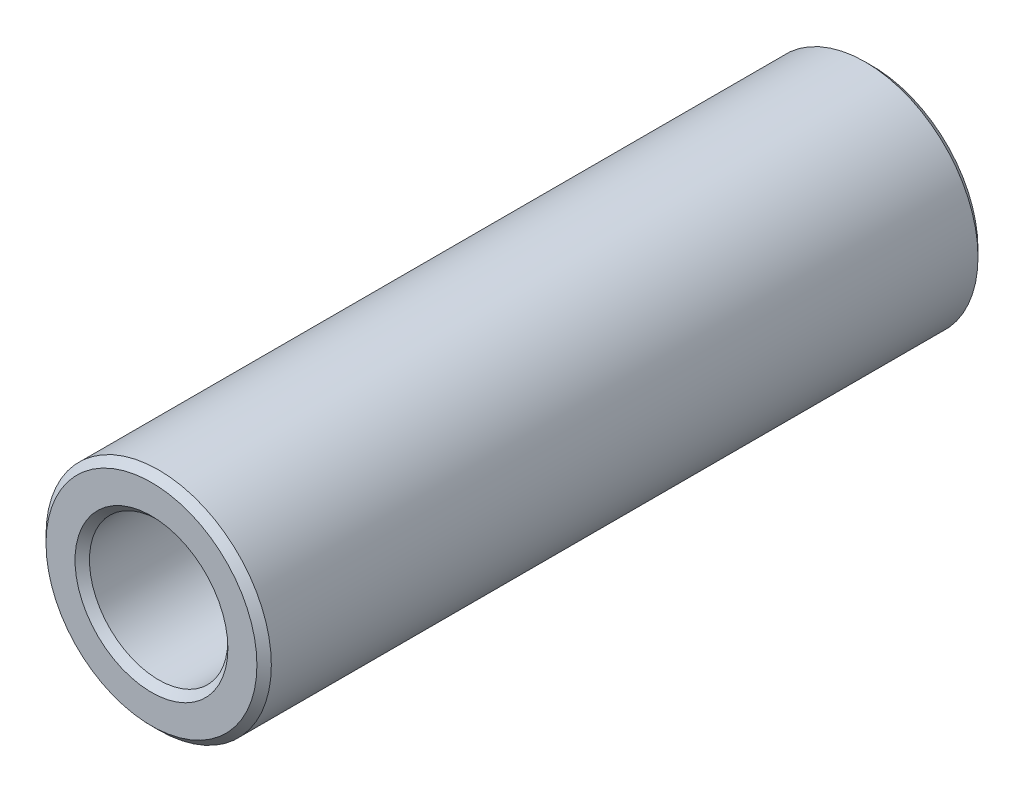
ISO-10303-21;
HEADER;
FILE_DESCRIPTION(('STEP AP214'),'2;1');
FILE_NAME('part.step','',(''),(''),'','','');
FILE_SCHEMA(('AUTOMOTIVE_DESIGN { 1 0 10303 214 1 1 1 1 }'));
ENDSEC;
DATA;
#1=APPLICATION_CONTEXT('core data for automotive mechanical design processes');
#2=APPLICATION_PROTOCOL_DEFINITION('international standard','automotive_design',2000,#1);
#3=PRODUCT_CONTEXT('',#1,'mechanical');
#4=PRODUCT('Part','Part','',(#3));
#5=PRODUCT_RELATED_PRODUCT_CATEGORY('part','',(#4));
#6=PRODUCT_DEFINITION_FORMATION('','',#4);
#7=PRODUCT_DEFINITION_CONTEXT('part definition',#1,'design');
#8=PRODUCT_DEFINITION('design','',#6,#7);
#9=PRODUCT_DEFINITION_SHAPE('','',#8);
#10=(LENGTH_UNIT() NAMED_UNIT(*) SI_UNIT(.MILLI.,.METRE.));
#11=(NAMED_UNIT(*) PLANE_ANGLE_UNIT() SI_UNIT($,.RADIAN.));
#12=(NAMED_UNIT(*) SI_UNIT($,.STERADIAN.) SOLID_ANGLE_UNIT());
#13=UNCERTAINTY_MEASURE_WITH_UNIT(LENGTH_MEASURE(1.E-05),#10,'distance_accuracy_value','');
#14=(GEOMETRIC_REPRESENTATION_CONTEXT(3) GLOBAL_UNCERTAINTY_ASSIGNED_CONTEXT((#13)) GLOBAL_UNIT_ASSIGNED_CONTEXT((#10,
#11,#12)) REPRESENTATION_CONTEXT('',''));
#15=CARTESIAN_POINT('',(0.,0.,0.));
#16=DIRECTION('',(0.,0.,1.));
#17=DIRECTION('',(1.,0.,0.));
#18=AXIS2_PLACEMENT_3D('',#15,#16,#17);
#19=CARTESIAN_POINT('',(0.,0.,25.146));
#20=DIRECTION('',(0.,0.,1.));
#21=DIRECTION('',(1.,0.,0.));
#22=AXIS2_PLACEMENT_3D('',#19,#20,#21);
#23=CONICAL_SURFACE('',#22,2.4384,0.785398163397442);
#24=CARTESIAN_POINT('',(0.,0.,25.146));
#25=DIRECTION('',(0.,0.,1.));
#26=DIRECTION('',(1.,0.,0.));
#27=AXIS2_PLACEMENT_3D('',#24,#25,#26);
#28=CIRCLE('',#27,2.4384);
#29=CARTESIAN_POINT('',(2.4384,0.,25.146));
#30=VERTEX_POINT('',#29);
#31=EDGE_CURVE('E27',#30,#30,#28,.T.);
#32=ORIENTED_EDGE('',*,*,#31,.F.);
#33=EDGE_LOOP('',(#32));
#34=FACE_BOUND('',#33,.T.);
#35=CARTESIAN_POINT('',(0.,0.,25.4));
#36=DIRECTION('',(0.,0.,-1.));
#37=DIRECTION('',(1.,0.,0.));
#38=AXIS2_PLACEMENT_3D('',#35,#36,#37);
#39=CIRCLE('',#38,2.6924);
#40=CARTESIAN_POINT('',(2.6924,0.,25.4));
#41=VERTEX_POINT('',#40);
#42=EDGE_CURVE('E57',#41,#41,#39,.T.);
#43=ORIENTED_EDGE('',*,*,#42,.F.);
#44=EDGE_LOOP('',(#43));
#45=FACE_BOUND('',#44,.T.);
#46=ADVANCED_FACE('F16',(#34,#45),#23,.F.);
#47=CARTESIAN_POINT('',(0.,0.,0.));
#48=DIRECTION('',(0.,0.,-1.));
#49=DIRECTION('',(-1.,0.,0.));
#50=AXIS2_PLACEMENT_3D('',#47,#48,#49);
#51=CONICAL_SURFACE('',#50,2.6924,0.785398163397442);
#52=CARTESIAN_POINT('',(0.,0.,0.254));
#53=DIRECTION('',(0.,0.,-1.));
#54=DIRECTION('',(1.,0.,0.));
#55=AXIS2_PLACEMENT_3D('',#52,#53,#54);
#56=CIRCLE('',#55,2.4384);
#57=CARTESIAN_POINT('',(2.4384,0.,0.254));
#58=VERTEX_POINT('',#57);
#59=EDGE_CURVE('E11',#58,#58,#56,.T.);
#60=ORIENTED_EDGE('',*,*,#59,.F.);
#61=EDGE_LOOP('',(#60));
#62=FACE_BOUND('',#61,.T.);
#63=CARTESIAN_POINT('',(0.,0.,0.));
#64=DIRECTION('',(0.,0.,1.));
#65=DIRECTION('',(1.,0.,0.));
#66=AXIS2_PLACEMENT_3D('',#63,#64,#65);
#67=CIRCLE('',#66,2.6924);
#68=CARTESIAN_POINT('',(2.6924,0.,0.));
#69=VERTEX_POINT('',#68);
#70=EDGE_CURVE('E75',#69,#69,#67,.T.);
#71=ORIENTED_EDGE('',*,*,#70,.F.);
#72=EDGE_LOOP('',(#71));
#73=FACE_BOUND('',#72,.T.);
#74=ADVANCED_FACE('F18',(#62,#73),#51,.F.);
#75=CARTESIAN_POINT('',(0.,0.,25.4));
#76=DIRECTION('',(0.,0.,-1.));
#77=DIRECTION('',(-1.,0.,0.));
#78=AXIS2_PLACEMENT_3D('',#75,#76,#77);
#79=CONICAL_SURFACE('',#78,3.71475,0.785398163397448);
#80=CARTESIAN_POINT('',(0.,0.,25.4));
#81=DIRECTION('',(0.,0.,1.));
#82=DIRECTION('',(1.,0.,0.));
#83=AXIS2_PLACEMENT_3D('',#80,#81,#82);
#84=CIRCLE('',#83,3.71475);
#85=CARTESIAN_POINT('',(3.71475,0.,25.4));
#86=VERTEX_POINT('',#85);
#87=EDGE_CURVE('E68',#86,#86,#84,.T.);
#88=ORIENTED_EDGE('',*,*,#87,.F.);
#89=EDGE_LOOP('',(#88));
#90=FACE_BOUND('',#89,.T.);
#91=CARTESIAN_POINT('',(0.,0.,25.146));
#92=DIRECTION('',(0.,0.,-1.));
#93=DIRECTION('',(1.,0.,0.));
#94=AXIS2_PLACEMENT_3D('',#91,#92,#93);
#95=CIRCLE('',#94,3.96875);
#96=CARTESIAN_POINT('',(3.96875,0.,25.146));
#97=VERTEX_POINT('',#96);
#98=EDGE_CURVE('E80',#97,#97,#95,.T.);
#99=ORIENTED_EDGE('',*,*,#98,.F.);
#100=EDGE_LOOP('',(#99));
#101=FACE_BOUND('',#100,.T.);
#102=ADVANCED_FACE('F171',(#90,#101),#79,.T.);
#103=CARTESIAN_POINT('',(0.,0.,0.254));
#104=DIRECTION('',(0.,0.,1.));
#105=DIRECTION('',(1.,0.,0.));
#106=AXIS2_PLACEMENT_3D('',#103,#104,#105);
#107=CONICAL_SURFACE('',#106,3.96875,0.785398163397455);
#108=CARTESIAN_POINT('',(0.,0.,0.));
#109=DIRECTION('',(0.,0.,-1.));
#110=DIRECTION('',(1.,0.,0.));
#111=AXIS2_PLACEMENT_3D('',#108,#109,#110);
#112=CIRCLE('',#111,3.71475);
#113=CARTESIAN_POINT('',(3.71475,0.,0.));
#114=VERTEX_POINT('',#113);
#115=EDGE_CURVE('E81',#114,#114,#112,.T.);
#116=ORIENTED_EDGE('',*,*,#115,.F.);
#117=EDGE_LOOP('',(#116));
#118=FACE_BOUND('',#117,.T.);
#119=CARTESIAN_POINT('',(0.,0.,0.254));
#120=DIRECTION('',(0.,0.,1.));
#121=DIRECTION('',(1.,0.,0.));
#122=AXIS2_PLACEMENT_3D('',#119,#120,#121);
#123=CIRCLE('',#122,3.96875);
#124=CARTESIAN_POINT('',(3.96875,0.,0.254));
#125=VERTEX_POINT('',#124);
#126=EDGE_CURVE('E20',#125,#125,#123,.T.);
#127=ORIENTED_EDGE('',*,*,#126,.F.);
#128=EDGE_LOOP('',(#127));
#129=FACE_BOUND('',#128,.T.);
#130=ADVANCED_FACE('F118',(#118,#129),#107,.T.);
#131=CARTESIAN_POINT('',(0.,0.,25.4));
#132=DIRECTION('',(0.,0.,-1.));
#133=DIRECTION('',(-1.,0.,0.));
#134=AXIS2_PLACEMENT_3D('',#131,#132,#133);
#135=CYLINDRICAL_SURFACE('',#134,2.4384);
#136=ORIENTED_EDGE('',*,*,#59,.T.);
#137=EDGE_LOOP('',(#136));
#138=FACE_BOUND('',#137,.T.);
#139=ORIENTED_EDGE('',*,*,#31,.T.);
#140=EDGE_LOOP('',(#139));
#141=FACE_BOUND('',#140,.T.);
#142=ADVANCED_FACE('F112',(#138,#141),#135,.F.);
#143=CARTESIAN_POINT('',(0.,0.,25.4));
#144=DIRECTION('',(0.,0.,-1.));
#145=DIRECTION('',(-1.,0.,0.));
#146=AXIS2_PLACEMENT_3D('',#143,#144,#145);
#147=CYLINDRICAL_SURFACE('',#146,3.96875);
#148=ORIENTED_EDGE('',*,*,#126,.T.);
#149=EDGE_LOOP('',(#148));
#150=FACE_BOUND('',#149,.T.);
#151=ORIENTED_EDGE('',*,*,#98,.T.);
#152=EDGE_LOOP('',(#151));
#153=FACE_BOUND('',#152,.T.);
#154=ADVANCED_FACE('F117',(#150,#153),#147,.T.);
#155=CARTESIAN_POINT('',(0.,0.,0.));
#156=DIRECTION('',(0.,0.,1.));
#157=DIRECTION('',(1.,0.,0.));
#158=AXIS2_PLACEMENT_3D('',#155,#156,#157);
#159=PLANE('',#158);
#160=ORIENTED_EDGE('',*,*,#70,.T.);
#161=EDGE_LOOP('',(#160));
#162=FACE_BOUND('',#161,.T.);
#163=ORIENTED_EDGE('',*,*,#115,.T.);
#164=EDGE_LOOP('',(#163));
#165=FACE_BOUND('',#164,.T.);
#166=ADVANCED_FACE('F76',(#162,#165),#159,.F.);
#167=CARTESIAN_POINT('',(0.,0.,25.4));
#168=DIRECTION('',(0.,0.,1.));
#169=DIRECTION('',(1.,0.,0.));
#170=AXIS2_PLACEMENT_3D('',#167,#168,#169);
#171=PLANE('',#170);
#172=ORIENTED_EDGE('',*,*,#42,.T.);
#173=EDGE_LOOP('',(#172));
#174=FACE_BOUND('',#173,.T.);
#175=ORIENTED_EDGE('',*,*,#87,.T.);
#176=EDGE_LOOP('',(#175));
#177=FACE_BOUND('',#176,.T.);
#178=ADVANCED_FACE('F128',(#174,#177),#171,.T.);
#179=CLOSED_SHELL('',(#46,#74,#102,#130,#142,#154,#166,#178));
#180=MANIFOLD_SOLID_BREP('B1',#179);
#181=ADVANCED_BREP_SHAPE_REPRESENTATION('',(#18,#180),#14);
#182=SHAPE_DEFINITION_REPRESENTATION(#9,#181);
ENDSEC;
END-ISO-10303-21;
